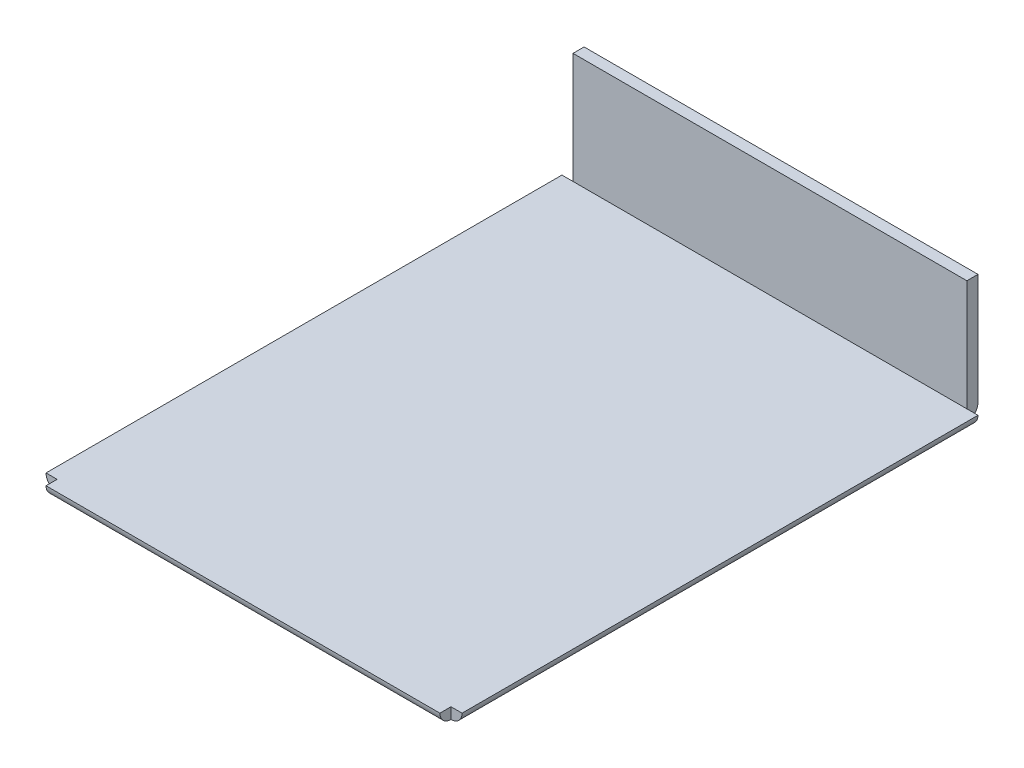
ISO-10303-21;
HEADER;
FILE_DESCRIPTION(('STEP AP214'),'2;1');
FILE_NAME('part.step','',(''),(''),'','','');
FILE_SCHEMA(('AUTOMOTIVE_DESIGN { 1 0 10303 214 1 1 1 1 }'));
ENDSEC;
DATA;
#1=APPLICATION_CONTEXT('core data for automotive mechanical design processes');
#2=APPLICATION_PROTOCOL_DEFINITION('international standard','automotive_design',2000,#1);
#3=PRODUCT_CONTEXT('',#1,'mechanical');
#4=PRODUCT('Part','Part','',(#3));
#5=PRODUCT_RELATED_PRODUCT_CATEGORY('part','',(#4));
#6=PRODUCT_DEFINITION_FORMATION('','',#4);
#7=PRODUCT_DEFINITION_CONTEXT('part definition',#1,'design');
#8=PRODUCT_DEFINITION('design','',#6,#7);
#9=PRODUCT_DEFINITION_SHAPE('','',#8);
#10=(LENGTH_UNIT() NAMED_UNIT(*) SI_UNIT(.MILLI.,.METRE.));
#11=(NAMED_UNIT(*) PLANE_ANGLE_UNIT() SI_UNIT($,.RADIAN.));
#12=(NAMED_UNIT(*) SI_UNIT($,.STERADIAN.) SOLID_ANGLE_UNIT());
#13=UNCERTAINTY_MEASURE_WITH_UNIT(LENGTH_MEASURE(1.E-05),#10,'distance_accuracy_value','');
#14=(GEOMETRIC_REPRESENTATION_CONTEXT(3) GLOBAL_UNCERTAINTY_ASSIGNED_CONTEXT((#13)) GLOBAL_UNIT_ASSIGNED_CONTEXT((#10,
#11,#12)) REPRESENTATION_CONTEXT('',''));
#15=CARTESIAN_POINT('',(0.,0.,0.));
#16=DIRECTION('',(0.,0.,1.));
#17=DIRECTION('',(1.,0.,0.));
#18=AXIS2_PLACEMENT_3D('',#15,#16,#17);
#19=CARTESIAN_POINT('',(0.,1.99999999999999,0.));
#20=DIRECTION('',(0.,-1.,0.));
#21=DIRECTION('',(0.,0.,-1.));
#22=AXIS2_PLACEMENT_3D('',#19,#20,#21);
#23=PLANE('',#22);
#24=DIRECTION('',(1.,0.,0.));
#25=VECTOR('',#24,1.);
#26=CARTESIAN_POINT('',(71.,1.99999999999999,-93.));
#27=LINE('',#26,#25);
#28=CARTESIAN_POINT('',(0.,2.00000000000013,-93.));
#29=VERTEX_POINT('',#28);
#30=CARTESIAN_POINT('',(71.,1.99999999999999,-93.));
#31=VERTEX_POINT('',#30);
#32=EDGE_CURVE('E214',#29,#31,#27,.T.);
#33=ORIENTED_EDGE('',*,*,#32,.F.);
#34=DIRECTION('',(-1.,0.,0.));
#35=VECTOR('',#34,1.);
#36=CARTESIAN_POINT('',(0.,1.99999999999999,-93.));
#37=LINE('',#36,#35);
#38=CARTESIAN_POINT('',(-2.00000000000009,2.00000000000013,-93.));
#39=VERTEX_POINT('',#38);
#40=EDGE_CURVE('E123',#29,#39,#37,.T.);
#41=ORIENTED_EDGE('',*,*,#40,.T.);
#42=DIRECTION('',(0.,0.,1.));
#43=VECTOR('',#42,1.);
#44=CARTESIAN_POINT('',(-2.00000000000009,2.00000000000013,-93.));
#45=LINE('',#44,#43);
#46=CARTESIAN_POINT('',(-1.99999999999999,2.00000000000004,0.));
#47=VERTEX_POINT('',#46);
#48=EDGE_CURVE('E238',#39,#47,#45,.T.);
#49=ORIENTED_EDGE('',*,*,#48,.T.);
#50=DIRECTION('',(1.,0.,0.));
#51=VECTOR('',#50,1.);
#52=CARTESIAN_POINT('',(-1.99999999999999,2.00000000000004,0.));
#53=LINE('',#52,#51);
#54=CARTESIAN_POINT('',(0.,1.99999999999999,0.));
#55=VERTEX_POINT('',#54);
#56=EDGE_CURVE('E241',#47,#55,#53,.T.);
#57=ORIENTED_EDGE('',*,*,#56,.T.);
#58=DIRECTION('',(0.,0.,1.));
#59=VECTOR('',#58,1.);
#60=CARTESIAN_POINT('',(0.,1.99999999999999,0.));
#61=LINE('',#60,#59);
#62=CARTESIAN_POINT('',(0.,2.00000000000009,2.00000000000006));
#63=VERTEX_POINT('',#62);
#64=EDGE_CURVE('E274',#55,#63,#61,.T.);
#65=ORIENTED_EDGE('',*,*,#64,.T.);
#66=DIRECTION('',(1.,0.,0.));
#67=VECTOR('',#66,1.);
#68=CARTESIAN_POINT('',(0.,2.00000000000009,2.00000000000006));
#69=LINE('',#68,#67);
#70=CARTESIAN_POINT('',(71.,2.00000000000003,1.99999999999999));
#71=VERTEX_POINT('',#70);
#72=EDGE_CURVE('E253',#63,#71,#69,.T.);
#73=ORIENTED_EDGE('',*,*,#72,.T.);
#74=DIRECTION('',(0.,0.,-1.));
#75=VECTOR('',#74,1.);
#76=CARTESIAN_POINT('',(71.,2.00000000000003,1.99999999999999));
#77=LINE('',#76,#75);
#78=CARTESIAN_POINT('',(71.,1.99999999999999,0.));
#79=VERTEX_POINT('',#78);
#80=EDGE_CURVE('E256',#71,#79,#77,.T.);
#81=ORIENTED_EDGE('',*,*,#80,.T.);
#82=DIRECTION('',(1.,0.,0.));
#83=VECTOR('',#82,1.);
#84=CARTESIAN_POINT('',(0.,1.99999999999999,0.));
#85=LINE('',#84,#83);
#86=CARTESIAN_POINT('',(73.,2.00000000000006,0.));
#87=VERTEX_POINT('',#86);
#88=EDGE_CURVE('E276',#79,#87,#85,.T.);
#89=ORIENTED_EDGE('',*,*,#88,.T.);
#90=DIRECTION('',(0.,0.,-1.));
#91=VECTOR('',#90,1.);
#92=CARTESIAN_POINT('',(73.,2.00000000000006,0.));
#93=LINE('',#92,#91);
#94=CARTESIAN_POINT('',(73.,2.00000000000006,-93.));
#95=VERTEX_POINT('',#94);
#96=EDGE_CURVE('E265',#87,#95,#93,.T.);
#97=ORIENTED_EDGE('',*,*,#96,.T.);
#98=EDGE_CURVE('E12',#95,#31,#37,.T.);
#99=ORIENTED_EDGE('',*,*,#98,.T.);
#100=EDGE_LOOP('',(#33,#41,#49,#57,#65,#73,#81,#89,#97,#99));
#101=FACE_BOUND('',#100,.T.);
#102=ADVANCED_FACE('F114',(#101),#23,.F.);
#103=CARTESIAN_POINT('',(0.,1.99999999999999,-93.));
#104=DIRECTION('',(0.,0.,1.));
#105=DIRECTION('',(1.,0.,0.));
#106=AXIS2_PLACEMENT_3D('',#103,#104,#105);
#107=PLANE('',#106);
#108=DIRECTION('',(0.,-1.,0.));
#109=VECTOR('',#108,1.);
#110=CARTESIAN_POINT('',(71.,0.,-93.));
#111=LINE('',#110,#109);
#112=CARTESIAN_POINT('',(71.,0.,-93.));
#113=VERTEX_POINT('',#112);
#114=EDGE_CURVE('E221',#31,#113,#111,.T.);
#115=ORIENTED_EDGE('',*,*,#114,.F.);
#116=ORIENTED_EDGE('',*,*,#98,.F.);
#117=CARTESIAN_POINT('',(71.,1.99999999999999,-93.));
#118=DIRECTION('',(0.,0.,-1.));
#119=DIRECTION('',(-1.,0.,0.));
#120=AXIS2_PLACEMENT_3D('',#117,#118,#119);
#121=CIRCLE('',#120,1.99999999999999);
#122=EDGE_CURVE('E268',#95,#113,#121,.T.);
#123=ORIENTED_EDGE('',*,*,#122,.T.);
#124=EDGE_LOOP('',(#115,#116,#123));
#125=FACE_BOUND('',#124,.T.);
#126=ADVANCED_FACE('F292',(#125),#107,.F.);
#127=DIRECTION('',(0.,1.,0.));
#128=VECTOR('',#127,1.);
#129=CARTESIAN_POINT('',(0.,0.,-93.));
#130=LINE('',#129,#128);
#131=CARTESIAN_POINT('',(0.,0.,-93.));
#132=VERTEX_POINT('',#131);
#133=EDGE_CURVE('E131',#132,#29,#130,.T.);
#134=ORIENTED_EDGE('',*,*,#133,.F.);
#135=CARTESIAN_POINT('',(0.,2.00000000000009,-93.));
#136=DIRECTION('',(0.,0.,1.));
#137=DIRECTION('',(0.,-1.,0.));
#138=AXIS2_PLACEMENT_3D('',#135,#136,#137);
#139=CIRCLE('',#138,2.00000000000009);
#140=EDGE_CURVE('E244',#39,#132,#139,.T.);
#141=ORIENTED_EDGE('',*,*,#140,.F.);
#142=ORIENTED_EDGE('',*,*,#40,.F.);
#143=EDGE_LOOP('',(#134,#141,#142));
#144=FACE_BOUND('',#143,.T.);
#145=ADVANCED_FACE('F319',(#144),#107,.F.);
#146=CARTESIAN_POINT('',(0.,1.99999999999999,0.));
#147=DIRECTION('',(1.,0.,0.));
#148=DIRECTION('',(0.,0.,-1.));
#149=AXIS2_PLACEMENT_3D('',#146,#147,#148);
#150=PLANE('',#149);
#151=DIRECTION('',(0.,1.,0.));
#152=VECTOR('',#151,1.);
#153=CARTESIAN_POINT('',(0.,0.,0.));
#154=LINE('',#153,#152);
#155=CARTESIAN_POINT('',(0.,0.,0.));
#156=VERTEX_POINT('',#155);
#157=EDGE_CURVE('E235',#156,#55,#154,.T.);
#158=ORIENTED_EDGE('',*,*,#157,.F.);
#159=CARTESIAN_POINT('',(0.,2.00000000000006,0.));
#160=DIRECTION('',(1.,0.,0.));
#161=DIRECTION('',(0.,1.,0.));
#162=AXIS2_PLACEMENT_3D('',#159,#160,#161);
#163=CIRCLE('',#162,2.00000000000006);
#164=EDGE_CURVE('E259',#63,#156,#163,.T.);
#165=ORIENTED_EDGE('',*,*,#164,.F.);
#166=ORIENTED_EDGE('',*,*,#64,.F.);
#167=EDGE_LOOP('',(#158,#165,#166));
#168=FACE_BOUND('',#167,.T.);
#169=ADVANCED_FACE('F116',(#168),#150,.F.);
#170=CARTESIAN_POINT('',(0.,1.99999999999999,0.));
#171=DIRECTION('',(0.,0.,-1.));
#172=DIRECTION('',(-1.,0.,0.));
#173=AXIS2_PLACEMENT_3D('',#170,#171,#172);
#174=PLANE('',#173);
#175=DIRECTION('',(0.,1.,0.));
#176=VECTOR('',#175,1.);
#177=CARTESIAN_POINT('',(71.,0.,0.));
#178=LINE('',#177,#176);
#179=CARTESIAN_POINT('',(71.,0.,0.));
#180=VERTEX_POINT('',#179);
#181=EDGE_CURVE('E250',#180,#79,#178,.T.);
#182=ORIENTED_EDGE('',*,*,#181,.F.);
#183=CARTESIAN_POINT('',(71.,1.99999999999999,0.));
#184=DIRECTION('',(0.,0.,-1.));
#185=DIRECTION('',(-1.,0.,0.));
#186=AXIS2_PLACEMENT_3D('',#183,#184,#185);
#187=CIRCLE('',#186,1.99999999999999);
#188=EDGE_CURVE('E270',#87,#180,#187,.T.);
#189=ORIENTED_EDGE('',*,*,#188,.F.);
#190=ORIENTED_EDGE('',*,*,#88,.F.);
#191=EDGE_LOOP('',(#182,#189,#190));
#192=FACE_BOUND('',#191,.T.);
#193=ADVANCED_FACE('F327',(#192),#174,.F.);
#194=CARTESIAN_POINT('',(0.,0.,0.));
#195=DIRECTION('',(0.,-1.,0.));
#196=DIRECTION('',(0.,0.,-1.));
#197=AXIS2_PLACEMENT_3D('',#194,#195,#196);
#198=PLANE('',#197);
#199=DIRECTION('',(0.,0.,1.));
#200=VECTOR('',#199,1.);
#201=CARTESIAN_POINT('',(0.,0.,0.));
#202=LINE('',#201,#200);
#203=EDGE_CURVE('E273',#132,#156,#202,.T.);
#204=ORIENTED_EDGE('',*,*,#203,.F.);
#205=DIRECTION('',(-1.,0.,0.));
#206=VECTOR('',#205,1.);
#207=CARTESIAN_POINT('',(0.,0.,-93.));
#208=LINE('',#207,#206);
#209=EDGE_CURVE('E118',#113,#132,#208,.T.);
#210=ORIENTED_EDGE('',*,*,#209,.F.);
#211=DIRECTION('',(0.,0.,-1.));
#212=VECTOR('',#211,1.);
#213=CARTESIAN_POINT('',(71.,0.,0.));
#214=LINE('',#213,#212);
#215=EDGE_CURVE('E282',#180,#113,#214,.T.);
#216=ORIENTED_EDGE('',*,*,#215,.F.);
#217=DIRECTION('',(1.,0.,0.));
#218=VECTOR('',#217,1.);
#219=CARTESIAN_POINT('',(0.,0.,0.));
#220=LINE('',#219,#218);
#221=EDGE_CURVE('E280',#156,#180,#220,.T.);
#222=ORIENTED_EDGE('',*,*,#221,.F.);
#223=EDGE_LOOP('',(#204,#210,#216,#222));
#224=FACE_BOUND('',#223,.T.);
#225=ADVANCED_FACE('F325',(#224),#198,.T.);
#226=CARTESIAN_POINT('',(71.,1.99999999999999,0.));
#227=DIRECTION('',(0.,0.,-1.));
#228=DIRECTION('',(-1.,0.,0.));
#229=AXIS2_PLACEMENT_3D('',#226,#227,#228);
#230=CYLINDRICAL_SURFACE('',#229,1.99999999999999);
#231=ORIENTED_EDGE('',*,*,#122,.F.);
#232=ORIENTED_EDGE('',*,*,#96,.F.);
#233=ORIENTED_EDGE('',*,*,#188,.T.);
#234=ORIENTED_EDGE('',*,*,#215,.T.);
#235=EDGE_LOOP('',(#231,#232,#233,#234));
#236=FACE_BOUND('',#235,.T.);
#237=ADVANCED_FACE('F323',(#236),#230,.T.);
#238=CARTESIAN_POINT('',(71.,2.00000000000003,1.99999999999999));
#239=DIRECTION('',(-1.,0.,0.));
#240=DIRECTION('',(0.,-1.,0.));
#241=AXIS2_PLACEMENT_3D('',#238,#239,#240);
#242=PLANE('',#241);
#243=CARTESIAN_POINT('',(71.,1.99999999999999,0.));
#244=DIRECTION('',(1.,0.,0.));
#245=DIRECTION('',(0.,1.,0.));
#246=AXIS2_PLACEMENT_3D('',#243,#244,#245);
#247=CIRCLE('',#246,1.99999999999999);
#248=EDGE_CURVE('E262',#71,#180,#247,.T.);
#249=ORIENTED_EDGE('',*,*,#248,.T.);
#250=ORIENTED_EDGE('',*,*,#181,.T.);
#251=ORIENTED_EDGE('',*,*,#80,.F.);
#252=EDGE_LOOP('',(#249,#250,#251));
#253=FACE_BOUND('',#252,.T.);
#254=ADVANCED_FACE('F339',(#253),#242,.F.);
#255=CARTESIAN_POINT('',(0.,2.00000000000006,0.));
#256=DIRECTION('',(1.,0.,0.));
#257=DIRECTION('',(0.,1.,0.));
#258=AXIS2_PLACEMENT_3D('',#255,#256,#257);
#259=CYLINDRICAL_SURFACE('',#258,2.00000000000002);
#260=ORIENTED_EDGE('',*,*,#72,.F.);
#261=ORIENTED_EDGE('',*,*,#164,.T.);
#262=ORIENTED_EDGE('',*,*,#221,.T.);
#263=ORIENTED_EDGE('',*,*,#248,.F.);
#264=EDGE_LOOP('',(#260,#261,#262,#263));
#265=FACE_BOUND('',#264,.T.);
#266=ADVANCED_FACE('F342',(#265),#259,.T.);
#267=CARTESIAN_POINT('',(-1.99999999999999,2.00000000000004,0.));
#268=DIRECTION('',(0.,0.,-1.));
#269=DIRECTION('',(0.,1.,0.));
#270=AXIS2_PLACEMENT_3D('',#267,#268,#269);
#271=PLANE('',#270);
#272=CARTESIAN_POINT('',(0.,1.99999999999999,0.));
#273=DIRECTION('',(0.,0.,1.));
#274=DIRECTION('',(0.,-1.,0.));
#275=AXIS2_PLACEMENT_3D('',#272,#273,#274);
#276=CIRCLE('',#275,1.99999999999999);
#277=EDGE_CURVE('E247',#47,#156,#276,.T.);
#278=ORIENTED_EDGE('',*,*,#277,.T.);
#279=ORIENTED_EDGE('',*,*,#157,.T.);
#280=ORIENTED_EDGE('',*,*,#56,.F.);
#281=EDGE_LOOP('',(#278,#279,#280));
#282=FACE_BOUND('',#281,.T.);
#283=ADVANCED_FACE('F346',(#282),#271,.F.);
#284=CARTESIAN_POINT('',(0.,2.00000000000009,-93.));
#285=DIRECTION('',(0.,0.,1.));
#286=DIRECTION('',(0.,-1.,0.));
#287=AXIS2_PLACEMENT_3D('',#284,#285,#286);
#288=CYLINDRICAL_SURFACE('',#287,2.00000000000004);
#289=ORIENTED_EDGE('',*,*,#48,.F.);
#290=ORIENTED_EDGE('',*,*,#140,.T.);
#291=ORIENTED_EDGE('',*,*,#203,.T.);
#292=ORIENTED_EDGE('',*,*,#277,.F.);
#293=EDGE_LOOP('',(#289,#290,#291,#292));
#294=FACE_BOUND('',#293,.T.);
#295=ADVANCED_FACE('F311',(#294),#288,.T.);
#296=CARTESIAN_POINT('',(71.,2.00000000000018,-95.0000000000001));
#297=DIRECTION('',(-1.,0.,0.));
#298=DIRECTION('',(0.,0.,1.));
#299=AXIS2_PLACEMENT_3D('',#296,#297,#298);
#300=PLANE('',#299);
#301=ORIENTED_EDGE('',*,*,#114,.T.);
#302=CARTESIAN_POINT('',(71.,2.00000000000013,-93.));
#303=DIRECTION('',(-1.,0.,0.));
#304=DIRECTION('',(0.,0.,1.));
#305=AXIS2_PLACEMENT_3D('',#302,#303,#304);
#306=CIRCLE('',#305,2.00000000000013);
#307=CARTESIAN_POINT('',(71.,2.00000000000018,-95.0000000000001));
#308=VERTEX_POINT('',#307);
#309=EDGE_CURVE('E219',#308,#113,#306,.T.);
#310=ORIENTED_EDGE('',*,*,#309,.F.);
#311=DIRECTION('',(0.,-1.,0.));
#312=VECTOR('',#311,1.);
#313=CARTESIAN_POINT('',(71.,22.,-95.0000000000001));
#314=LINE('',#313,#312);
#315=CARTESIAN_POINT('',(71.,22.,-95.0000000000001));
#316=VERTEX_POINT('',#315);
#317=EDGE_CURVE('E199',#316,#308,#314,.T.);
#318=ORIENTED_EDGE('',*,*,#317,.F.);
#319=DIRECTION('',(0.,0.,-1.));
#320=VECTOR('',#319,1.);
#321=CARTESIAN_POINT('',(71.,22.,-95.0000000000001));
#322=LINE('',#321,#320);
#323=CARTESIAN_POINT('',(71.,22.,-93.));
#324=VERTEX_POINT('',#323);
#325=EDGE_CURVE('E205',#324,#316,#322,.T.);
#326=ORIENTED_EDGE('',*,*,#325,.F.);
#327=DIRECTION('',(0.,-1.,0.));
#328=VECTOR('',#327,1.);
#329=CARTESIAN_POINT('',(71.,22.,-93.));
#330=LINE('',#329,#328);
#331=EDGE_CURVE('E289',#324,#31,#330,.T.);
#332=ORIENTED_EDGE('',*,*,#331,.T.);
#333=EDGE_LOOP('',(#301,#310,#318,#326,#332));
#334=FACE_BOUND('',#333,.T.);
#335=ADVANCED_FACE('F217',(#334),#300,.F.);
#336=CARTESIAN_POINT('',(0.,2.00000000000018,-95.0000000000001));
#337=DIRECTION('',(1.,0.,0.));
#338=DIRECTION('',(0.,0.,-1.));
#339=AXIS2_PLACEMENT_3D('',#336,#337,#338);
#340=PLANE('',#339);
#341=CARTESIAN_POINT('',(0.,2.00000000000013,-93.));
#342=DIRECTION('',(-1.,0.,0.));
#343=DIRECTION('',(0.,0.,1.));
#344=AXIS2_PLACEMENT_3D('',#341,#342,#343);
#345=CIRCLE('',#344,2.00000000000013);
#346=CARTESIAN_POINT('',(0.,2.00000000000018,-95.0000000000001));
#347=VERTEX_POINT('',#346);
#348=EDGE_CURVE('E232',#347,#132,#345,.T.);
#349=ORIENTED_EDGE('',*,*,#348,.T.);
#350=ORIENTED_EDGE('',*,*,#133,.T.);
#351=DIRECTION('',(0.,-1.,0.));
#352=VECTOR('',#351,1.);
#353=CARTESIAN_POINT('',(0.,22.,-93.));
#354=LINE('',#353,#352);
#355=CARTESIAN_POINT('',(0.,22.,-93.));
#356=VERTEX_POINT('',#355);
#357=EDGE_CURVE('E224',#356,#29,#354,.T.);
#358=ORIENTED_EDGE('',*,*,#357,.F.);
#359=DIRECTION('',(0.,0.,1.));
#360=VECTOR('',#359,1.);
#361=CARTESIAN_POINT('',(0.,22.,-95.0000000000001));
#362=LINE('',#361,#360);
#363=CARTESIAN_POINT('',(0.,22.,-95.0000000000001));
#364=VERTEX_POINT('',#363);
#365=EDGE_CURVE('E204',#364,#356,#362,.T.);
#366=ORIENTED_EDGE('',*,*,#365,.F.);
#367=DIRECTION('',(0.,-1.,0.));
#368=VECTOR('',#367,1.);
#369=CARTESIAN_POINT('',(0.,22.,-95.0000000000001));
#370=LINE('',#369,#368);
#371=EDGE_CURVE('E201',#364,#347,#370,.T.);
#372=ORIENTED_EDGE('',*,*,#371,.T.);
#373=EDGE_LOOP('',(#349,#350,#358,#366,#372));
#374=FACE_BOUND('',#373,.T.);
#375=ADVANCED_FACE('F303',(#374),#340,.F.);
#376=CARTESIAN_POINT('',(71.,2.00000000000013,-93.));
#377=DIRECTION('',(-1.,0.,0.));
#378=DIRECTION('',(0.,0.,1.));
#379=AXIS2_PLACEMENT_3D('',#376,#377,#378);
#380=CYLINDRICAL_SURFACE('',#379,2.00000000000013);
#381=DIRECTION('',(-1.,0.,0.));
#382=VECTOR('',#381,1.);
#383=CARTESIAN_POINT('',(71.,2.00000000000018,-95.0000000000001));
#384=LINE('',#383,#382);
#385=EDGE_CURVE('E229',#308,#347,#384,.T.);
#386=ORIENTED_EDGE('',*,*,#385,.F.);
#387=ORIENTED_EDGE('',*,*,#309,.T.);
#388=ORIENTED_EDGE('',*,*,#209,.T.);
#389=ORIENTED_EDGE('',*,*,#348,.F.);
#390=EDGE_LOOP('',(#386,#387,#388,#389));
#391=FACE_BOUND('',#390,.T.);
#392=ADVANCED_FACE('F287',(#391),#380,.T.);
#393=CARTESIAN_POINT('',(71.,22.,-95.0000000000001));
#394=DIRECTION('',(0.,0.,1.));
#395=DIRECTION('',(1.,0.,0.));
#396=AXIS2_PLACEMENT_3D('',#393,#394,#395);
#397=PLANE('',#396);
#398=ORIENTED_EDGE('',*,*,#385,.T.);
#399=ORIENTED_EDGE('',*,*,#371,.F.);
#400=DIRECTION('',(-1.,0.,0.));
#401=VECTOR('',#400,1.);
#402=CARTESIAN_POINT('',(71.,22.,-95.0000000000001));
#403=LINE('',#402,#401);
#404=EDGE_CURVE('E194',#316,#364,#403,.T.);
#405=ORIENTED_EDGE('',*,*,#404,.F.);
#406=ORIENTED_EDGE('',*,*,#317,.T.);
#407=EDGE_LOOP('',(#398,#399,#405,#406));
#408=FACE_BOUND('',#407,.T.);
#409=ADVANCED_FACE('F197',(#408),#397,.F.);
#410=CARTESIAN_POINT('',(71.,22.,-93.));
#411=DIRECTION('',(0.,0.,-1.));
#412=DIRECTION('',(-1.,0.,0.));
#413=AXIS2_PLACEMENT_3D('',#410,#411,#412);
#414=PLANE('',#413);
#415=ORIENTED_EDGE('',*,*,#32,.T.);
#416=ORIENTED_EDGE('',*,*,#331,.F.);
#417=DIRECTION('',(1.,0.,0.));
#418=VECTOR('',#417,1.);
#419=CARTESIAN_POINT('',(71.,22.,-93.));
#420=LINE('',#419,#418);
#421=EDGE_CURVE('E210',#356,#324,#420,.T.);
#422=ORIENTED_EDGE('',*,*,#421,.F.);
#423=ORIENTED_EDGE('',*,*,#357,.T.);
#424=EDGE_LOOP('',(#415,#416,#422,#423));
#425=FACE_BOUND('',#424,.T.);
#426=ADVANCED_FACE('F295',(#425),#414,.F.);
#427=CARTESIAN_POINT('',(0.,22.,0.));
#428=DIRECTION('',(0.,-1.,0.));
#429=DIRECTION('',(0.,0.,-1.));
#430=AXIS2_PLACEMENT_3D('',#427,#428,#429);
#431=PLANE('',#430);
#432=ORIENTED_EDGE('',*,*,#325,.T.);
#433=ORIENTED_EDGE('',*,*,#404,.T.);
#434=ORIENTED_EDGE('',*,*,#365,.T.);
#435=ORIENTED_EDGE('',*,*,#421,.T.);
#436=EDGE_LOOP('',(#432,#433,#434,#435));
#437=FACE_BOUND('',#436,.T.);
#438=ADVANCED_FACE('F208',(#437),#431,.F.);
#439=CLOSED_SHELL('',(#102,#126,#145,#169,#193,#225,#237,#254,#266,#283,#295,#335,#375,#392,
#409,#426,#438));
#440=MANIFOLD_SOLID_BREP('B2',#439);
#441=ADVANCED_BREP_SHAPE_REPRESENTATION('',(#18,#440),#14);
#442=SHAPE_DEFINITION_REPRESENTATION(#9,#441);
ENDSEC;
END-ISO-10303-21;
